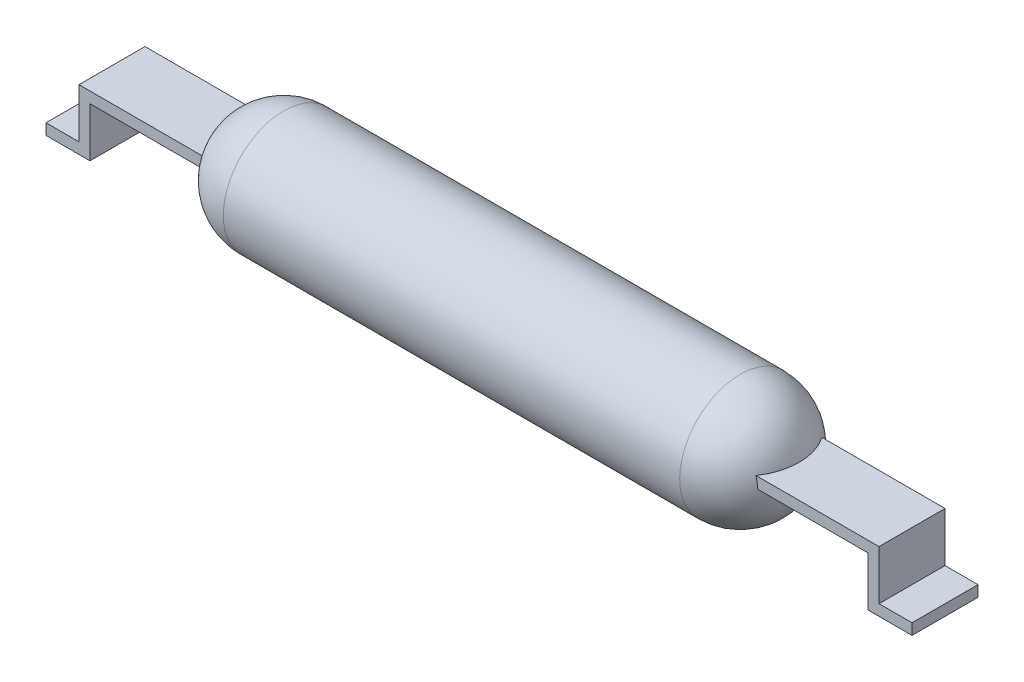
ISO-10303-21;
HEADER;
FILE_DESCRIPTION(('STEP AP214'),'2;1');
FILE_NAME('part.step','',(''),(''),'','','');
FILE_SCHEMA(('AUTOMOTIVE_DESIGN { 1 0 10303 214 1 1 1 1 }'));
ENDSEC;
DATA;
#1=APPLICATION_CONTEXT('core data for automotive mechanical design processes');
#2=APPLICATION_PROTOCOL_DEFINITION('international standard','automotive_design',2000,#1);
#3=PRODUCT_CONTEXT('',#1,'mechanical');
#4=PRODUCT('Part','Part','',(#3));
#5=PRODUCT_RELATED_PRODUCT_CATEGORY('part','',(#4));
#6=PRODUCT_DEFINITION_FORMATION('','',#4);
#7=PRODUCT_DEFINITION_CONTEXT('part definition',#1,'design');
#8=PRODUCT_DEFINITION('design','',#6,#7);
#9=PRODUCT_DEFINITION_SHAPE('','',#8);
#10=(LENGTH_UNIT() NAMED_UNIT(*) SI_UNIT(.MILLI.,.METRE.));
#11=(NAMED_UNIT(*) PLANE_ANGLE_UNIT() SI_UNIT($,.RADIAN.));
#12=(NAMED_UNIT(*) SI_UNIT($,.STERADIAN.) SOLID_ANGLE_UNIT());
#13=UNCERTAINTY_MEASURE_WITH_UNIT(LENGTH_MEASURE(1.E-05),#10,'distance_accuracy_value','');
#14=(GEOMETRIC_REPRESENTATION_CONTEXT(3) GLOBAL_UNCERTAINTY_ASSIGNED_CONTEXT((#13)) GLOBAL_UNIT_ASSIGNED_CONTEXT((#10,
#11,#12)) REPRESENTATION_CONTEXT('',''));
#15=CARTESIAN_POINT('',(0.,0.,0.));
#16=DIRECTION('',(0.,0.,1.));
#17=DIRECTION('',(1.,0.,0.));
#18=AXIS2_PLACEMENT_3D('',#15,#16,#17);
#19=CARTESIAN_POINT('',(0.415,0.,0.));
#20=DIRECTION('',(-1.,0.,0.));
#21=DIRECTION('',(0.,0.,1.));
#22=AXIS2_PLACEMENT_3D('',#19,#20,#21);
#23=SPHERICAL_SURFACE('',#22,0.11);
#24=CARTESIAN_POINT('',(0.415,0.,0.));
#25=DIRECTION('',(-1.,0.,0.));
#26=DIRECTION('',(0.,0.,1.));
#27=AXIS2_PLACEMENT_3D('',#24,#25,#26);
#28=CIRCLE('',#27,0.11);
#29=CARTESIAN_POINT('',(0.415,0.,0.11));
#30=VERTEX_POINT('',#29);
#31=EDGE_CURVE('E250',#30,#30,#28,.T.);
#32=ORIENTED_EDGE('',*,*,#31,.F.);
#33=EDGE_LOOP('',(#32));
#34=FACE_BOUND('',#33,.T.);
#35=CARTESIAN_POINT('',(0.415,0.025,0.));
#36=DIRECTION('',(0.,1.,0.));
#37=DIRECTION('',(-1.,0.,0.));
#38=AXIS2_PLACEMENT_3D('',#35,#36,#37);
#39=CIRCLE('',#38,0.107121426428143);
#40=CARTESIAN_POINT('',(0.503741196746494,0.025,-0.06));
#41=VERTEX_POINT('',#40);
#42=CARTESIAN_POINT('',(0.503741196746494,0.025,0.06));
#43=VERTEX_POINT('',#42);
#44=EDGE_CURVE('E43',#41,#43,#39,.F.);
#45=ORIENTED_EDGE('',*,*,#44,.F.);
#46=CARTESIAN_POINT('',(0.415,0.,-0.06));
#47=DIRECTION('',(0.,0.,1.));
#48=DIRECTION('',(1.,0.,0.));
#49=AXIS2_PLACEMENT_3D('',#46,#47,#48);
#50=CIRCLE('',#49,0.0921954445729289);
#51=CARTESIAN_POINT('',(0.50705976319761,0.00500000000000002,-0.06));
#52=VERTEX_POINT('',#51);
#53=EDGE_CURVE('E11',#41,#52,#50,.F.);
#54=ORIENTED_EDGE('',*,*,#53,.T.);
#55=CARTESIAN_POINT('',(0.415,0.00500000000000002,0.));
#56=DIRECTION('',(0.,-1.,0.));
#57=DIRECTION('',(1.,0.,0.));
#58=AXIS2_PLACEMENT_3D('',#55,#56,#57);
#59=CIRCLE('',#58,0.10988630487918);
#60=CARTESIAN_POINT('',(0.50705976319761,0.00500000000000002,0.06));
#61=VERTEX_POINT('',#60);
#62=EDGE_CURVE('E277',#61,#52,#59,.F.);
#63=ORIENTED_EDGE('',*,*,#62,.F.);
#64=CARTESIAN_POINT('',(0.415,0.,0.06));
#65=DIRECTION('',(0.,0.,1.));
#66=DIRECTION('',(1.,0.,0.));
#67=AXIS2_PLACEMENT_3D('',#64,#65,#66);
#68=CIRCLE('',#67,0.0921954445729289);
#69=EDGE_CURVE('E152',#43,#61,#68,.F.);
#70=ORIENTED_EDGE('',*,*,#69,.F.);
#71=EDGE_LOOP('',(#45,#54,#63,#70));
#72=FACE_BOUND('',#71,.T.);
#73=ADVANCED_FACE('F36',(#34,#72),#23,.T.);
#74=CARTESIAN_POINT('',(-0.525,0.,0.));
#75=DIRECTION('',(-1.,0.,0.));
#76=DIRECTION('',(0.,0.,1.));
#77=AXIS2_PLACEMENT_3D('',#74,#75,#76);
#78=CYLINDRICAL_SURFACE('',#77,0.11);
#79=CARTESIAN_POINT('',(-0.415,0.,0.));
#80=DIRECTION('',(-1.,0.,0.));
#81=DIRECTION('',(0.,0.,1.));
#82=AXIS2_PLACEMENT_3D('',#79,#80,#81);
#83=CIRCLE('',#82,0.11);
#84=CARTESIAN_POINT('',(-0.415,0.,0.11));
#85=VERTEX_POINT('',#84);
#86=EDGE_CURVE('E263',#85,#85,#83,.F.);
#87=ORIENTED_EDGE('',*,*,#86,.T.);
#88=EDGE_LOOP('',(#87));
#89=FACE_BOUND('',#88,.T.);
#90=ORIENTED_EDGE('',*,*,#31,.T.);
#91=EDGE_LOOP('',(#90));
#92=FACE_BOUND('',#91,.T.);
#93=ADVANCED_FACE('F308',(#89,#92),#78,.T.);
#94=CARTESIAN_POINT('',(-0.415,0.,0.));
#95=DIRECTION('',(1.,0.,0.));
#96=DIRECTION('',(0.,0.,-1.));
#97=AXIS2_PLACEMENT_3D('',#94,#95,#96);
#98=SPHERICAL_SURFACE('',#97,0.11);
#99=CARTESIAN_POINT('',(-0.415,0.,-0.06));
#100=DIRECTION('',(0.,0.,-1.));
#101=DIRECTION('',(-1.,0.,0.));
#102=AXIS2_PLACEMENT_3D('',#99,#100,#101);
#103=CIRCLE('',#102,0.0921954445729289);
#104=CARTESIAN_POINT('',(-0.503741196746494,0.025,-0.06));
#105=VERTEX_POINT('',#104);
#106=CARTESIAN_POINT('',(-0.50705976319761,0.00500000000000002,-0.06));
#107=VERTEX_POINT('',#106);
#108=EDGE_CURVE('E274',#105,#107,#103,.F.);
#109=ORIENTED_EDGE('',*,*,#108,.F.);
#110=CARTESIAN_POINT('',(-0.415,0.025,0.));
#111=DIRECTION('',(0.,1.,0.));
#112=DIRECTION('',(-1.,0.,0.));
#113=AXIS2_PLACEMENT_3D('',#110,#111,#112);
#114=CIRCLE('',#113,0.107121426428143);
#115=CARTESIAN_POINT('',(-0.503741196746494,0.025,0.06));
#116=VERTEX_POINT('',#115);
#117=EDGE_CURVE('E272',#116,#105,#114,.F.);
#118=ORIENTED_EDGE('',*,*,#117,.F.);
#119=CARTESIAN_POINT('',(-0.415,0.,0.06));
#120=DIRECTION('',(0.,0.,-1.));
#121=DIRECTION('',(-1.,0.,0.));
#122=AXIS2_PLACEMENT_3D('',#119,#120,#121);
#123=CIRCLE('',#122,0.0921954445729289);
#124=CARTESIAN_POINT('',(-0.50705976319761,0.00500000000000002,0.06));
#125=VERTEX_POINT('',#124);
#126=EDGE_CURVE('E266',#116,#125,#123,.F.);
#127=ORIENTED_EDGE('',*,*,#126,.T.);
#128=CARTESIAN_POINT('',(-0.415,0.00500000000000002,0.));
#129=DIRECTION('',(0.,-1.,0.));
#130=DIRECTION('',(1.,0.,0.));
#131=AXIS2_PLACEMENT_3D('',#128,#129,#130);
#132=CIRCLE('',#131,0.10988630487918);
#133=EDGE_CURVE('E269',#107,#125,#132,.F.);
#134=ORIENTED_EDGE('',*,*,#133,.F.);
#135=EDGE_LOOP('',(#109,#118,#127,#134));
#136=FACE_BOUND('',#135,.T.);
#137=ORIENTED_EDGE('',*,*,#86,.F.);
#138=EDGE_LOOP('',(#137));
#139=FACE_BOUND('',#138,.T.);
#140=ADVANCED_FACE('F313',(#136,#139),#98,.T.);
#141=CARTESIAN_POINT('',(-0.7075,0.00500000000000001,-0.06));
#142=DIRECTION('',(1.,0.,0.));
#143=DIRECTION('',(0.,0.,-1.));
#144=AXIS2_PLACEMENT_3D('',#141,#142,#143);
#145=PLANE('',#144);
#146=DIRECTION('',(0.,0.,1.));
#147=VECTOR('',#146,1.);
#148=CARTESIAN_POINT('',(-0.7075,0.00500000000000001,-0.06));
#149=LINE('',#148,#147);
#150=CARTESIAN_POINT('',(-0.7075,0.00500000000000001,-0.06));
#151=VERTEX_POINT('',#150);
#152=CARTESIAN_POINT('',(-0.7075,0.00500000000000001,0.06));
#153=VERTEX_POINT('',#152);
#154=EDGE_CURVE('E247',#151,#153,#149,.T.);
#155=ORIENTED_EDGE('',*,*,#154,.T.);
#156=DIRECTION('',(0.,1.,0.));
#157=VECTOR('',#156,1.);
#158=CARTESIAN_POINT('',(-0.7075,0.00500000000000001,0.06));
#159=LINE('',#158,#157);
#160=CARTESIAN_POINT('',(-0.7075,-0.085,0.06));
#161=VERTEX_POINT('',#160);
#162=EDGE_CURVE('E201',#161,#153,#159,.T.);
#163=ORIENTED_EDGE('',*,*,#162,.F.);
#164=DIRECTION('',(0.,0.,1.));
#165=VECTOR('',#164,1.);
#166=CARTESIAN_POINT('',(-0.7075,-0.085,-0.06));
#167=LINE('',#166,#165);
#168=CARTESIAN_POINT('',(-0.7075,-0.085,-0.06));
#169=VERTEX_POINT('',#168);
#170=EDGE_CURVE('E248',#169,#161,#167,.T.);
#171=ORIENTED_EDGE('',*,*,#170,.F.);
#172=DIRECTION('',(0.,1.,0.));
#173=VECTOR('',#172,1.);
#174=CARTESIAN_POINT('',(-0.7075,0.00500000000000001,-0.06));
#175=LINE('',#174,#173);
#176=EDGE_CURVE('E227',#169,#151,#175,.T.);
#177=ORIENTED_EDGE('',*,*,#176,.T.);
#178=EDGE_LOOP('',(#155,#163,#171,#177));
#179=FACE_BOUND('',#178,.T.);
#180=ADVANCED_FACE('F321',(#179),#145,.T.);
#181=CARTESIAN_POINT('',(-0.7075,-0.085,-0.06));
#182=DIRECTION('',(0.,-1.,0.));
#183=DIRECTION('',(1.,0.,0.));
#184=AXIS2_PLACEMENT_3D('',#181,#182,#183);
#185=PLANE('',#184);
#186=ORIENTED_EDGE('',*,*,#170,.T.);
#187=DIRECTION('',(1.,0.,0.));
#188=VECTOR('',#187,1.);
#189=CARTESIAN_POINT('',(-0.7075,-0.085,0.06));
#190=LINE('',#189,#188);
#191=CARTESIAN_POINT('',(-0.7875,-0.085,0.06));
#192=VERTEX_POINT('',#191);
#193=EDGE_CURVE('E224',#192,#161,#190,.T.);
#194=ORIENTED_EDGE('',*,*,#193,.F.);
#195=DIRECTION('',(0.,0.,1.));
#196=VECTOR('',#195,1.);
#197=CARTESIAN_POINT('',(-0.7875,-0.085,-0.06));
#198=LINE('',#197,#196);
#199=CARTESIAN_POINT('',(-0.7875,-0.085,-0.06));
#200=VERTEX_POINT('',#199);
#201=EDGE_CURVE('E251',#200,#192,#198,.T.);
#202=ORIENTED_EDGE('',*,*,#201,.F.);
#203=DIRECTION('',(1.,0.,0.));
#204=VECTOR('',#203,1.);
#205=CARTESIAN_POINT('',(-0.7075,-0.085,-0.06));
#206=LINE('',#205,#204);
#207=EDGE_CURVE('E244',#200,#169,#206,.T.);
#208=ORIENTED_EDGE('',*,*,#207,.T.);
#209=EDGE_LOOP('',(#186,#194,#202,#208));
#210=FACE_BOUND('',#209,.T.);
#211=ADVANCED_FACE('F326',(#210),#185,.T.);
#212=CARTESIAN_POINT('',(-0.7875,-0.085,-0.06));
#213=DIRECTION('',(-1.,0.,0.));
#214=DIRECTION('',(0.,0.,1.));
#215=AXIS2_PLACEMENT_3D('',#212,#213,#214);
#216=PLANE('',#215);
#217=ORIENTED_EDGE('',*,*,#201,.T.);
#218=DIRECTION('',(0.,-1.,0.));
#219=VECTOR('',#218,1.);
#220=CARTESIAN_POINT('',(-0.7875,-0.085,0.06));
#221=LINE('',#220,#219);
#222=CARTESIAN_POINT('',(-0.7875,-0.065,0.06));
#223=VERTEX_POINT('',#222);
#224=EDGE_CURVE('E221',#223,#192,#221,.T.);
#225=ORIENTED_EDGE('',*,*,#224,.F.);
#226=DIRECTION('',(0.,0.,1.));
#227=VECTOR('',#226,1.);
#228=CARTESIAN_POINT('',(-0.7875,-0.065,-0.06));
#229=LINE('',#228,#227);
#230=CARTESIAN_POINT('',(-0.7875,-0.065,-0.06));
#231=VERTEX_POINT('',#230);
#232=EDGE_CURVE('E253',#231,#223,#229,.T.);
#233=ORIENTED_EDGE('',*,*,#232,.F.);
#234=DIRECTION('',(0.,-1.,0.));
#235=VECTOR('',#234,1.);
#236=CARTESIAN_POINT('',(-0.7875,-0.085,-0.06));
#237=LINE('',#236,#235);
#238=EDGE_CURVE('E241',#231,#200,#237,.T.);
#239=ORIENTED_EDGE('',*,*,#238,.T.);
#240=EDGE_LOOP('',(#217,#225,#233,#239));
#241=FACE_BOUND('',#240,.T.);
#242=ADVANCED_FACE('F344',(#241),#216,.T.);
#243=CARTESIAN_POINT('',(-0.7875,-0.065,-0.06));
#244=DIRECTION('',(0.,1.,0.));
#245=DIRECTION('',(0.,0.,1.));
#246=AXIS2_PLACEMENT_3D('',#243,#244,#245);
#247=PLANE('',#246);
#248=ORIENTED_EDGE('',*,*,#232,.T.);
#249=DIRECTION('',(-1.,0.,0.));
#250=VECTOR('',#249,1.);
#251=CARTESIAN_POINT('',(-0.7875,-0.065,0.06));
#252=LINE('',#251,#250);
#253=CARTESIAN_POINT('',(-0.7275,-0.065,0.06));
#254=VERTEX_POINT('',#253);
#255=EDGE_CURVE('E218',#254,#223,#252,.T.);
#256=ORIENTED_EDGE('',*,*,#255,.F.);
#257=DIRECTION('',(0.,0.,1.));
#258=VECTOR('',#257,1.);
#259=CARTESIAN_POINT('',(-0.7275,-0.065,-0.06));
#260=LINE('',#259,#258);
#261=CARTESIAN_POINT('',(-0.7275,-0.065,-0.06));
#262=VERTEX_POINT('',#261);
#263=EDGE_CURVE('E255',#262,#254,#260,.T.);
#264=ORIENTED_EDGE('',*,*,#263,.F.);
#265=DIRECTION('',(-1.,0.,0.));
#266=VECTOR('',#265,1.);
#267=CARTESIAN_POINT('',(-0.7875,-0.065,-0.06));
#268=LINE('',#267,#266);
#269=EDGE_CURVE('E238',#262,#231,#268,.T.);
#270=ORIENTED_EDGE('',*,*,#269,.T.);
#271=EDGE_LOOP('',(#248,#256,#264,#270));
#272=FACE_BOUND('',#271,.T.);
#273=ADVANCED_FACE('F340',(#272),#247,.T.);
#274=CARTESIAN_POINT('',(-0.7275,-0.065,-0.06));
#275=DIRECTION('',(-1.,0.,0.));
#276=DIRECTION('',(0.,0.,1.));
#277=AXIS2_PLACEMENT_3D('',#274,#275,#276);
#278=PLANE('',#277);
#279=ORIENTED_EDGE('',*,*,#263,.T.);
#280=DIRECTION('',(0.,-1.,0.));
#281=VECTOR('',#280,1.);
#282=CARTESIAN_POINT('',(-0.7275,-0.065,0.06));
#283=LINE('',#282,#281);
#284=CARTESIAN_POINT('',(-0.7275,0.025,0.06));
#285=VERTEX_POINT('',#284);
#286=EDGE_CURVE('E215',#285,#254,#283,.T.);
#287=ORIENTED_EDGE('',*,*,#286,.F.);
#288=DIRECTION('',(0.,0.,1.));
#289=VECTOR('',#288,1.);
#290=CARTESIAN_POINT('',(-0.7275,0.025,-0.06));
#291=LINE('',#290,#289);
#292=CARTESIAN_POINT('',(-0.7275,0.025,-0.06));
#293=VERTEX_POINT('',#292);
#294=EDGE_CURVE('E257',#293,#285,#291,.T.);
#295=ORIENTED_EDGE('',*,*,#294,.F.);
#296=DIRECTION('',(0.,-1.,0.));
#297=VECTOR('',#296,1.);
#298=CARTESIAN_POINT('',(-0.7275,-0.065,-0.06));
#299=LINE('',#298,#297);
#300=EDGE_CURVE('E235',#293,#262,#299,.T.);
#301=ORIENTED_EDGE('',*,*,#300,.T.);
#302=EDGE_LOOP('',(#279,#287,#295,#301));
#303=FACE_BOUND('',#302,.T.);
#304=ADVANCED_FACE('F336',(#303),#278,.T.);
#305=CARTESIAN_POINT('',(-0.7275,0.025,-0.06));
#306=DIRECTION('',(0.,1.,0.));
#307=DIRECTION('',(-1.,0.,0.));
#308=AXIS2_PLACEMENT_3D('',#305,#306,#307);
#309=PLANE('',#308);
#310=DIRECTION('',(-1.,0.,0.));
#311=VECTOR('',#310,1.);
#312=CARTESIAN_POINT('',(-0.7275,0.025,0.06));
#313=LINE('',#312,#311);
#314=EDGE_CURVE('E213',#116,#285,#313,.T.);
#315=ORIENTED_EDGE('',*,*,#314,.F.);
#316=ORIENTED_EDGE('',*,*,#117,.T.);
#317=DIRECTION('',(-1.,0.,0.));
#318=VECTOR('',#317,1.);
#319=CARTESIAN_POINT('',(-0.7275,0.025,-0.06));
#320=LINE('',#319,#318);
#321=EDGE_CURVE('E233',#105,#293,#320,.T.);
#322=ORIENTED_EDGE('',*,*,#321,.T.);
#323=ORIENTED_EDGE('',*,*,#294,.T.);
#324=EDGE_LOOP('',(#315,#316,#322,#323));
#325=FACE_BOUND('',#324,.T.);
#326=ADVANCED_FACE('F332',(#325),#309,.T.);
#327=CARTESIAN_POINT('',(-0.415,0.00500000000000002,-0.06));
#328=DIRECTION('',(0.,-1.,0.));
#329=DIRECTION('',(1.,0.,0.));
#330=AXIS2_PLACEMENT_3D('',#327,#328,#329);
#331=PLANE('',#330);
#332=DIRECTION('',(1.,0.,0.));
#333=VECTOR('',#332,1.);
#334=CARTESIAN_POINT('',(-0.415,0.00500000000000002,-0.06));
#335=LINE('',#334,#333);
#336=EDGE_CURVE('E230',#151,#107,#335,.T.);
#337=ORIENTED_EDGE('',*,*,#336,.T.);
#338=ORIENTED_EDGE('',*,*,#133,.T.);
#339=DIRECTION('',(1.,0.,0.));
#340=VECTOR('',#339,1.);
#341=CARTESIAN_POINT('',(-0.415,0.00500000000000002,0.06));
#342=LINE('',#341,#340);
#343=EDGE_CURVE('E211',#153,#125,#342,.T.);
#344=ORIENTED_EDGE('',*,*,#343,.F.);
#345=ORIENTED_EDGE('',*,*,#154,.F.);
#346=EDGE_LOOP('',(#337,#338,#344,#345));
#347=FACE_BOUND('',#346,.T.);
#348=ADVANCED_FACE('F328',(#347),#331,.T.);
#349=CARTESIAN_POINT('',(0.,0.,-0.06));
#350=DIRECTION('',(0.,0.,-1.));
#351=DIRECTION('',(-1.,0.,0.));
#352=AXIS2_PLACEMENT_3D('',#349,#350,#351);
#353=PLANE('',#352);
#354=ORIENTED_EDGE('',*,*,#321,.F.);
#355=ORIENTED_EDGE('',*,*,#108,.T.);
#356=ORIENTED_EDGE('',*,*,#336,.F.);
#357=ORIENTED_EDGE('',*,*,#176,.F.);
#358=ORIENTED_EDGE('',*,*,#207,.F.);
#359=ORIENTED_EDGE('',*,*,#238,.F.);
#360=ORIENTED_EDGE('',*,*,#269,.F.);
#361=ORIENTED_EDGE('',*,*,#300,.F.);
#362=EDGE_LOOP('',(#354,#355,#356,#357,#358,#359,#360,#361));
#363=FACE_BOUND('',#362,.T.);
#364=ADVANCED_FACE('F331',(#363),#353,.T.);
#365=CARTESIAN_POINT('',(0.,0.,0.06));
#366=DIRECTION('',(0.,0.,-1.));
#367=DIRECTION('',(-1.,0.,0.));
#368=AXIS2_PLACEMENT_3D('',#365,#366,#367);
#369=PLANE('',#368);
#370=ORIENTED_EDGE('',*,*,#126,.F.);
#371=ORIENTED_EDGE('',*,*,#314,.T.);
#372=ORIENTED_EDGE('',*,*,#286,.T.);
#373=ORIENTED_EDGE('',*,*,#255,.T.);
#374=ORIENTED_EDGE('',*,*,#224,.T.);
#375=ORIENTED_EDGE('',*,*,#193,.T.);
#376=ORIENTED_EDGE('',*,*,#162,.T.);
#377=ORIENTED_EDGE('',*,*,#343,.T.);
#378=EDGE_LOOP('',(#370,#371,#372,#373,#374,#375,#376,#377));
#379=FACE_BOUND('',#378,.T.);
#380=ADVANCED_FACE('F354',(#379),#369,.F.);
#381=CARTESIAN_POINT('',(0.7275,0.025,-0.06));
#382=DIRECTION('',(0.,1.,0.));
#383=DIRECTION('',(-1.,0.,0.));
#384=AXIS2_PLACEMENT_3D('',#381,#382,#383);
#385=PLANE('',#384);
#386=DIRECTION('',(-1.,0.,0.));
#387=VECTOR('',#386,1.);
#388=CARTESIAN_POINT('',(0.7275,0.025,-0.06));
#389=LINE('',#388,#387);
#390=CARTESIAN_POINT('',(0.7275,0.025,-0.06));
#391=VERTEX_POINT('',#390);
#392=EDGE_CURVE('E164',#391,#41,#389,.T.);
#393=ORIENTED_EDGE('',*,*,#392,.T.);
#394=ORIENTED_EDGE('',*,*,#44,.T.);
#395=DIRECTION('',(-1.,0.,0.));
#396=VECTOR('',#395,1.);
#397=CARTESIAN_POINT('',(0.7275,0.025,0.06));
#398=LINE('',#397,#396);
#399=CARTESIAN_POINT('',(0.7275,0.025,0.06));
#400=VERTEX_POINT('',#399);
#401=EDGE_CURVE('E180',#400,#43,#398,.T.);
#402=ORIENTED_EDGE('',*,*,#401,.F.);
#403=DIRECTION('',(0.,0.,1.));
#404=VECTOR('',#403,1.);
#405=CARTESIAN_POINT('',(0.7275,0.025,-0.06));
#406=LINE('',#405,#404);
#407=EDGE_CURVE('E199',#391,#400,#406,.T.);
#408=ORIENTED_EDGE('',*,*,#407,.F.);
#409=EDGE_LOOP('',(#393,#394,#402,#408));
#410=FACE_BOUND('',#409,.T.);
#411=ADVANCED_FACE('F280',(#410),#385,.T.);
#412=CARTESIAN_POINT('',(0.7275,-0.065,-0.06));
#413=DIRECTION('',(1.,0.,0.));
#414=DIRECTION('',(0.,0.,-1.));
#415=AXIS2_PLACEMENT_3D('',#412,#413,#414);
#416=PLANE('',#415);
#417=ORIENTED_EDGE('',*,*,#407,.T.);
#418=DIRECTION('',(0.,1.,0.));
#419=VECTOR('',#418,1.);
#420=CARTESIAN_POINT('',(0.7275,-0.065,0.06));
#421=LINE('',#420,#419);
#422=CARTESIAN_POINT('',(0.7275,-0.065,0.06));
#423=VERTEX_POINT('',#422);
#424=EDGE_CURVE('E177',#423,#400,#421,.T.);
#425=ORIENTED_EDGE('',*,*,#424,.F.);
#426=DIRECTION('',(0.,0.,1.));
#427=VECTOR('',#426,1.);
#428=CARTESIAN_POINT('',(0.7275,-0.065,-0.06));
#429=LINE('',#428,#427);
#430=CARTESIAN_POINT('',(0.7275,-0.065,-0.06));
#431=VERTEX_POINT('',#430);
#432=EDGE_CURVE('E202',#431,#423,#429,.T.);
#433=ORIENTED_EDGE('',*,*,#432,.F.);
#434=DIRECTION('',(0.,1.,0.));
#435=VECTOR('',#434,1.);
#436=CARTESIAN_POINT('',(0.7275,-0.065,-0.06));
#437=LINE('',#436,#435);
#438=EDGE_CURVE('E194',#431,#391,#437,.T.);
#439=ORIENTED_EDGE('',*,*,#438,.T.);
#440=EDGE_LOOP('',(#417,#425,#433,#439));
#441=FACE_BOUND('',#440,.T.);
#442=ADVANCED_FACE('F285',(#441),#416,.T.);
#443=CARTESIAN_POINT('',(0.7875,-0.065,-0.06));
#444=DIRECTION('',(0.,1.,0.));
#445=DIRECTION('',(0.,0.,1.));
#446=AXIS2_PLACEMENT_3D('',#443,#444,#445);
#447=PLANE('',#446);
#448=ORIENTED_EDGE('',*,*,#432,.T.);
#449=DIRECTION('',(-1.,0.,0.));
#450=VECTOR('',#449,1.);
#451=CARTESIAN_POINT('',(0.7875,-0.065,0.06));
#452=LINE('',#451,#450);
#453=CARTESIAN_POINT('',(0.7875,-0.065,0.06));
#454=VERTEX_POINT('',#453);
#455=EDGE_CURVE('E174',#454,#423,#452,.T.);
#456=ORIENTED_EDGE('',*,*,#455,.F.);
#457=DIRECTION('',(0.,0.,1.));
#458=VECTOR('',#457,1.);
#459=CARTESIAN_POINT('',(0.7875,-0.065,-0.06));
#460=LINE('',#459,#458);
#461=CARTESIAN_POINT('',(0.7875,-0.065,-0.06));
#462=VERTEX_POINT('',#461);
#463=EDGE_CURVE('E204',#462,#454,#460,.T.);
#464=ORIENTED_EDGE('',*,*,#463,.F.);
#465=DIRECTION('',(-1.,0.,0.));
#466=VECTOR('',#465,1.);
#467=CARTESIAN_POINT('',(0.7875,-0.065,-0.06));
#468=LINE('',#467,#466);
#469=EDGE_CURVE('E191',#462,#431,#468,.T.);
#470=ORIENTED_EDGE('',*,*,#469,.T.);
#471=EDGE_LOOP('',(#448,#456,#464,#470));
#472=FACE_BOUND('',#471,.T.);
#473=ADVANCED_FACE('F298',(#472),#447,.T.);
#474=CARTESIAN_POINT('',(0.7875,-0.085,-0.06));
#475=DIRECTION('',(1.,0.,0.));
#476=DIRECTION('',(0.,0.,-1.));
#477=AXIS2_PLACEMENT_3D('',#474,#475,#476);
#478=PLANE('',#477);
#479=ORIENTED_EDGE('',*,*,#463,.T.);
#480=DIRECTION('',(0.,1.,0.));
#481=VECTOR('',#480,1.);
#482=CARTESIAN_POINT('',(0.7875,-0.085,0.06));
#483=LINE('',#482,#481);
#484=CARTESIAN_POINT('',(0.7875,-0.085,0.06));
#485=VERTEX_POINT('',#484);
#486=EDGE_CURVE('E169',#485,#454,#483,.T.);
#487=ORIENTED_EDGE('',*,*,#486,.F.);
#488=DIRECTION('',(0.,0.,1.));
#489=VECTOR('',#488,1.);
#490=CARTESIAN_POINT('',(0.7875,-0.085,-0.06));
#491=LINE('',#490,#489);
#492=CARTESIAN_POINT('',(0.7875,-0.085,-0.06));
#493=VERTEX_POINT('',#492);
#494=EDGE_CURVE('E206',#493,#485,#491,.T.);
#495=ORIENTED_EDGE('',*,*,#494,.F.);
#496=DIRECTION('',(0.,1.,0.));
#497=VECTOR('',#496,1.);
#498=CARTESIAN_POINT('',(0.7875,-0.085,-0.06));
#499=LINE('',#498,#497);
#500=EDGE_CURVE('E188',#493,#462,#499,.T.);
#501=ORIENTED_EDGE('',*,*,#500,.T.);
#502=EDGE_LOOP('',(#479,#487,#495,#501));
#503=FACE_BOUND('',#502,.T.);
#504=ADVANCED_FACE('F296',(#503),#478,.T.);
#505=CARTESIAN_POINT('',(0.7075,-0.085,-0.06));
#506=DIRECTION('',(0.,-1.,0.));
#507=DIRECTION('',(1.,0.,0.));
#508=AXIS2_PLACEMENT_3D('',#505,#506,#507);
#509=PLANE('',#508);
#510=ORIENTED_EDGE('',*,*,#494,.T.);
#511=DIRECTION('',(1.,0.,0.));
#512=VECTOR('',#511,1.);
#513=CARTESIAN_POINT('',(0.7075,-0.085,0.06));
#514=LINE('',#513,#512);
#515=CARTESIAN_POINT('',(0.7075,-0.085,0.06));
#516=VERTEX_POINT('',#515);
#517=EDGE_CURVE('E167',#516,#485,#514,.T.);
#518=ORIENTED_EDGE('',*,*,#517,.F.);
#519=DIRECTION('',(0.,0.,1.));
#520=VECTOR('',#519,1.);
#521=CARTESIAN_POINT('',(0.7075,-0.085,-0.06));
#522=LINE('',#521,#520);
#523=CARTESIAN_POINT('',(0.7075,-0.085,-0.06));
#524=VERTEX_POINT('',#523);
#525=EDGE_CURVE('E163',#524,#516,#522,.T.);
#526=ORIENTED_EDGE('',*,*,#525,.F.);
#527=DIRECTION('',(1.,0.,0.));
#528=VECTOR('',#527,1.);
#529=CARTESIAN_POINT('',(0.7075,-0.085,-0.06));
#530=LINE('',#529,#528);
#531=EDGE_CURVE('E185',#524,#493,#530,.T.);
#532=ORIENTED_EDGE('',*,*,#531,.T.);
#533=EDGE_LOOP('',(#510,#518,#526,#532));
#534=FACE_BOUND('',#533,.T.);
#535=ADVANCED_FACE('F293',(#534),#509,.T.);
#536=CARTESIAN_POINT('',(0.7075,0.00500000000000001,-0.06));
#537=DIRECTION('',(-1.,0.,0.));
#538=DIRECTION('',(0.,0.,1.));
#539=AXIS2_PLACEMENT_3D('',#536,#537,#538);
#540=PLANE('',#539);
#541=ORIENTED_EDGE('',*,*,#525,.T.);
#542=DIRECTION('',(0.,-1.,0.));
#543=VECTOR('',#542,1.);
#544=CARTESIAN_POINT('',(0.7075,0.00500000000000001,0.06));
#545=LINE('',#544,#543);
#546=CARTESIAN_POINT('',(0.7075,0.00500000000000001,0.06));
#547=VERTEX_POINT('',#546);
#548=EDGE_CURVE('E150',#547,#516,#545,.T.);
#549=ORIENTED_EDGE('',*,*,#548,.F.);
#550=DIRECTION('',(0.,0.,1.));
#551=VECTOR('',#550,1.);
#552=CARTESIAN_POINT('',(0.7075,0.00500000000000001,-0.06));
#553=LINE('',#552,#551);
#554=CARTESIAN_POINT('',(0.7075,0.00500000000000001,-0.06));
#555=VERTEX_POINT('',#554);
#556=EDGE_CURVE('E156',#555,#547,#553,.T.);
#557=ORIENTED_EDGE('',*,*,#556,.F.);
#558=DIRECTION('',(0.,-1.,0.));
#559=VECTOR('',#558,1.);
#560=CARTESIAN_POINT('',(0.7075,0.00500000000000001,-0.06));
#561=LINE('',#560,#559);
#562=EDGE_CURVE('E183',#555,#524,#561,.T.);
#563=ORIENTED_EDGE('',*,*,#562,.T.);
#564=EDGE_LOOP('',(#541,#549,#557,#563));
#565=FACE_BOUND('',#564,.T.);
#566=ADVANCED_FACE('F166',(#565),#540,.T.);
#567=CARTESIAN_POINT('',(0.415,0.00500000000000002,-0.06));
#568=DIRECTION('',(0.,-1.,0.));
#569=DIRECTION('',(1.,0.,0.));
#570=AXIS2_PLACEMENT_3D('',#567,#568,#569);
#571=PLANE('',#570);
#572=DIRECTION('',(1.,0.,0.));
#573=VECTOR('',#572,1.);
#574=CARTESIAN_POINT('',(0.415,0.00500000000000002,0.06));
#575=LINE('',#574,#573);
#576=EDGE_CURVE('E144',#61,#547,#575,.T.);
#577=ORIENTED_EDGE('',*,*,#576,.F.);
#578=ORIENTED_EDGE('',*,*,#62,.T.);
#579=DIRECTION('',(1.,0.,0.));
#580=VECTOR('',#579,1.);
#581=CARTESIAN_POINT('',(0.415,0.00500000000000002,-0.06));
#582=LINE('',#581,#580);
#583=EDGE_CURVE('E159',#52,#555,#582,.T.);
#584=ORIENTED_EDGE('',*,*,#583,.T.);
#585=ORIENTED_EDGE('',*,*,#556,.T.);
#586=EDGE_LOOP('',(#577,#578,#584,#585));
#587=FACE_BOUND('',#586,.T.);
#588=ADVANCED_FACE('F157',(#587),#571,.T.);
#589=CARTESIAN_POINT('',(0.,0.,-0.06));
#590=DIRECTION('',(0.,0.,1.));
#591=DIRECTION('',(1.,0.,0.));
#592=AXIS2_PLACEMENT_3D('',#589,#590,#591);
#593=PLANE('',#592);
#594=ORIENTED_EDGE('',*,*,#53,.F.);
#595=ORIENTED_EDGE('',*,*,#392,.F.);
#596=ORIENTED_EDGE('',*,*,#438,.F.);
#597=ORIENTED_EDGE('',*,*,#469,.F.);
#598=ORIENTED_EDGE('',*,*,#500,.F.);
#599=ORIENTED_EDGE('',*,*,#531,.F.);
#600=ORIENTED_EDGE('',*,*,#562,.F.);
#601=ORIENTED_EDGE('',*,*,#583,.F.);
#602=EDGE_LOOP('',(#594,#595,#596,#597,#598,#599,#600,#601));
#603=FACE_BOUND('',#602,.T.);
#604=ADVANCED_FACE('F289',(#603),#593,.F.);
#605=CARTESIAN_POINT('',(0.,0.,0.06));
#606=DIRECTION('',(0.,0.,1.));
#607=DIRECTION('',(1.,0.,0.));
#608=AXIS2_PLACEMENT_3D('',#605,#606,#607);
#609=PLANE('',#608);
#610=ORIENTED_EDGE('',*,*,#401,.T.);
#611=ORIENTED_EDGE('',*,*,#69,.T.);
#612=ORIENTED_EDGE('',*,*,#576,.T.);
#613=ORIENTED_EDGE('',*,*,#548,.T.);
#614=ORIENTED_EDGE('',*,*,#517,.T.);
#615=ORIENTED_EDGE('',*,*,#486,.T.);
#616=ORIENTED_EDGE('',*,*,#455,.T.);
#617=ORIENTED_EDGE('',*,*,#424,.T.);
#618=EDGE_LOOP('',(#610,#611,#612,#613,#614,#615,#616,#617));
#619=FACE_BOUND('',#618,.T.);
#620=ADVANCED_FACE('F147',(#619),#609,.T.);
#621=CLOSED_SHELL('',(#73,#93,#140,#180,#211,#242,#273,#304,#326,#348,#364,#380,#411,#442,#473,
#504,#535,#566,#588,#604,#620));
#622=MANIFOLD_SOLID_BREP('B2',#621);
#623=ADVANCED_BREP_SHAPE_REPRESENTATION('',(#18,#622),#14);
#624=SHAPE_DEFINITION_REPRESENTATION(#9,#623);
ENDSEC;
END-ISO-10303-21;
